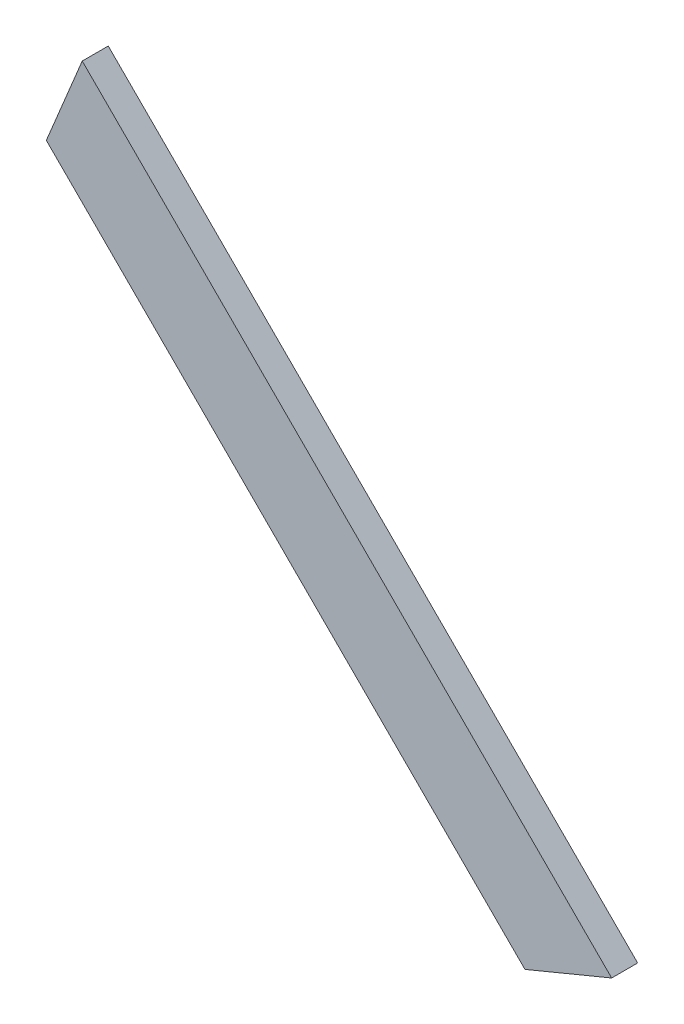
ISO-10303-21;
HEADER;
FILE_DESCRIPTION(('STEP AP214'),'2;1');
FILE_NAME('part.step','',(''),(''),'','','');
FILE_SCHEMA(('AUTOMOTIVE_DESIGN { 1 0 10303 214 1 1 1 1 }'));
ENDSEC;
DATA;
#1=APPLICATION_CONTEXT('core data for automotive mechanical design processes');
#2=APPLICATION_PROTOCOL_DEFINITION('international standard','automotive_design',2000,#1);
#3=PRODUCT_CONTEXT('',#1,'mechanical');
#4=PRODUCT('Part','Part','',(#3));
#5=PRODUCT_RELATED_PRODUCT_CATEGORY('part','',(#4));
#6=PRODUCT_DEFINITION_FORMATION('','',#4);
#7=PRODUCT_DEFINITION_CONTEXT('part definition',#1,'design');
#8=PRODUCT_DEFINITION('design','',#6,#7);
#9=PRODUCT_DEFINITION_SHAPE('','',#8);
#10=(LENGTH_UNIT() NAMED_UNIT(*) SI_UNIT(.MILLI.,.METRE.));
#11=(NAMED_UNIT(*) PLANE_ANGLE_UNIT() SI_UNIT($,.RADIAN.));
#12=(NAMED_UNIT(*) SI_UNIT($,.STERADIAN.) SOLID_ANGLE_UNIT());
#13=UNCERTAINTY_MEASURE_WITH_UNIT(LENGTH_MEASURE(1.E-05),#10,'distance_accuracy_value','');
#14=(GEOMETRIC_REPRESENTATION_CONTEXT(3) GLOBAL_UNCERTAINTY_ASSIGNED_CONTEXT((#13)) GLOBAL_UNIT_ASSIGNED_CONTEXT((#10,
#11,#12)) REPRESENTATION_CONTEXT('',''));
#15=CARTESIAN_POINT('',(0.,0.,0.));
#16=DIRECTION('',(0.,0.,1.));
#17=DIRECTION('',(1.,0.,0.));
#18=AXIS2_PLACEMENT_3D('',#15,#16,#17);
#19=CARTESIAN_POINT('',(-528.085778854874,1843.94678718592,19.05));
#20=DIRECTION('',(0.923879532511288,-0.382683432365086,0.));
#21=DIRECTION('',(0.382683432365086,0.923879532511288,0.));
#22=AXIS2_PLACEMENT_3D('',#19,#20,#21);
#23=PLANE('',#22);
#24=DIRECTION('',(-0.382683432365086,-0.923879532511288,0.));
#25=VECTOR('',#24,1.);
#26=CARTESIAN_POINT('',(-528.085778854874,1843.94678718592,0.));
#27=LINE('',#26,#25);
#28=CARTESIAN_POINT('',(-528.085778854874,1843.94678718592,0.));
#29=VERTEX_POINT('',#28);
#30=CARTESIAN_POINT('',(-554.388340065565,1780.44678718592,0.));
#31=VERTEX_POINT('',#30);
#32=EDGE_CURVE('E96',#29,#31,#27,.T.);
#33=ORIENTED_EDGE('',*,*,#32,.T.);
#34=DIRECTION('',(0.,0.,-1.));
#35=VECTOR('',#34,1.);
#36=CARTESIAN_POINT('',(-554.388340065565,1780.44678718592,19.05));
#37=LINE('',#36,#35);
#38=CARTESIAN_POINT('',(-554.388340065565,1780.44678718592,19.05));
#39=VERTEX_POINT('',#38);
#40=EDGE_CURVE('E11',#39,#31,#37,.T.);
#41=ORIENTED_EDGE('',*,*,#40,.F.);
#42=DIRECTION('',(-0.382683432365086,-0.923879532511288,0.));
#43=VECTOR('',#42,1.);
#44=CARTESIAN_POINT('',(-528.085778854874,1843.94678718592,19.05));
#45=LINE('',#44,#43);
#46=CARTESIAN_POINT('',(-528.085778854874,1843.94678718592,19.05));
#47=VERTEX_POINT('',#46);
#48=EDGE_CURVE('E84',#47,#39,#45,.T.);
#49=ORIENTED_EDGE('',*,*,#48,.F.);
#50=DIRECTION('',(0.,0.,-1.));
#51=VECTOR('',#50,1.);
#52=CARTESIAN_POINT('',(-528.085778854874,1843.94678718592,19.05));
#53=LINE('',#52,#51);
#54=EDGE_CURVE('E92',#47,#29,#53,.T.);
#55=ORIENTED_EDGE('',*,*,#54,.T.);
#56=EDGE_LOOP('',(#33,#41,#49,#55));
#57=FACE_BOUND('',#56,.T.);
#58=ADVANCED_FACE('F33',(#57),#23,.F.);
#59=CARTESIAN_POINT('',(-554.388340065565,1780.44678718592,19.05));
#60=DIRECTION('',(0.707106781186548,0.707106781186548,0.));
#61=DIRECTION('',(-0.707106781186548,0.707106781186548,0.));
#62=AXIS2_PLACEMENT_3D('',#59,#60,#61);
#63=PLANE('',#62);
#64=DIRECTION('',(0.707106781186548,-0.707106781186548,0.));
#65=VECTOR('',#64,1.);
#66=CARTESIAN_POINT('',(-554.388340065565,1780.44678718592,0.));
#67=LINE('',#66,#65);
#68=CARTESIAN_POINT('',(-203.784498249527,1429.84294536988,0.));
#69=VERTEX_POINT('',#68);
#70=EDGE_CURVE('E88',#31,#69,#67,.T.);
#71=ORIENTED_EDGE('',*,*,#70,.T.);
#72=DIRECTION('',(0.,0.,-1.));
#73=VECTOR('',#72,1.);
#74=CARTESIAN_POINT('',(-203.784498249527,1429.84294536988,19.05));
#75=LINE('',#74,#73);
#76=CARTESIAN_POINT('',(-203.784498249527,1429.84294536988,19.05));
#77=VERTEX_POINT('',#76);
#78=EDGE_CURVE('E41',#77,#69,#75,.T.);
#79=ORIENTED_EDGE('',*,*,#78,.F.);
#80=DIRECTION('',(0.707106781186548,-0.707106781186548,0.));
#81=VECTOR('',#80,1.);
#82=CARTESIAN_POINT('',(-554.388340065565,1780.44678718592,19.05));
#83=LINE('',#82,#81);
#84=EDGE_CURVE('E79',#39,#77,#83,.T.);
#85=ORIENTED_EDGE('',*,*,#84,.F.);
#86=ORIENTED_EDGE('',*,*,#40,.T.);
#87=EDGE_LOOP('',(#71,#79,#85,#86));
#88=FACE_BOUND('',#87,.T.);
#89=ADVANCED_FACE('F87',(#88),#63,.F.);
#90=CARTESIAN_POINT('',(-140.284498249528,1456.14550658058,19.05));
#91=DIRECTION('',(-0.38268343236509,0.923879532511287,0.));
#92=DIRECTION('',(-0.923879532511287,-0.38268343236509,0.));
#93=AXIS2_PLACEMENT_3D('',#90,#91,#92);
#94=PLANE('',#93);
#95=DIRECTION('',(0.923879532511287,0.38268343236509,0.));
#96=VECTOR('',#95,1.);
#97=CARTESIAN_POINT('',(-140.284498249528,1456.14550658058,0.));
#98=LINE('',#97,#96);
#99=CARTESIAN_POINT('',(-140.284498249528,1456.14550658058,0.));
#100=VERTEX_POINT('',#99);
#101=EDGE_CURVE('E66',#69,#100,#98,.T.);
#102=ORIENTED_EDGE('',*,*,#101,.T.);
#103=DIRECTION('',(0.,0.,-1.));
#104=VECTOR('',#103,1.);
#105=CARTESIAN_POINT('',(-140.284498249528,1456.14550658058,19.05));
#106=LINE('',#105,#104);
#107=CARTESIAN_POINT('',(-140.284498249528,1456.14550658058,19.05));
#108=VERTEX_POINT('',#107);
#109=EDGE_CURVE('E89',#108,#100,#106,.T.);
#110=ORIENTED_EDGE('',*,*,#109,.F.);
#111=DIRECTION('',(0.923879532511287,0.38268343236509,0.));
#112=VECTOR('',#111,1.);
#113=CARTESIAN_POINT('',(-140.284498249528,1456.14550658058,19.05));
#114=LINE('',#113,#112);
#115=EDGE_CURVE('E82',#77,#108,#114,.T.);
#116=ORIENTED_EDGE('',*,*,#115,.F.);
#117=ORIENTED_EDGE('',*,*,#78,.T.);
#118=EDGE_LOOP('',(#102,#110,#116,#117));
#119=FACE_BOUND('',#118,.T.);
#120=ADVANCED_FACE('F90',(#119),#94,.F.);
#121=CARTESIAN_POINT('',(-528.085778854874,1843.94678718592,19.05));
#122=DIRECTION('',(-0.707106781186547,-0.707106781186548,0.));
#123=DIRECTION('',(0.707106781186548,-0.707106781186547,0.));
#124=AXIS2_PLACEMENT_3D('',#121,#122,#123);
#125=PLANE('',#124);
#126=DIRECTION('',(-0.707106781186548,0.707106781186547,0.));
#127=VECTOR('',#126,1.);
#128=CARTESIAN_POINT('',(-528.085778854874,1843.94678718592,0.));
#129=LINE('',#128,#127);
#130=EDGE_CURVE('E72',#100,#29,#129,.T.);
#131=ORIENTED_EDGE('',*,*,#130,.T.);
#132=ORIENTED_EDGE('',*,*,#54,.F.);
#133=DIRECTION('',(-0.707106781186548,0.707106781186547,0.));
#134=VECTOR('',#133,1.);
#135=CARTESIAN_POINT('',(-528.085778854874,1843.94678718592,19.05));
#136=LINE('',#135,#134);
#137=EDGE_CURVE('E49',#108,#47,#136,.T.);
#138=ORIENTED_EDGE('',*,*,#137,.F.);
#139=ORIENTED_EDGE('',*,*,#109,.T.);
#140=EDGE_LOOP('',(#131,#132,#138,#139));
#141=FACE_BOUND('',#140,.T.);
#142=ADVANCED_FACE('F103',(#141),#125,.F.);
#143=CARTESIAN_POINT('',(0.,0.,19.05));
#144=DIRECTION('',(0.,0.,1.));
#145=DIRECTION('',(1.,0.,0.));
#146=AXIS2_PLACEMENT_3D('',#143,#144,#145);
#147=PLANE('',#146);
#148=ORIENTED_EDGE('',*,*,#48,.T.);
#149=ORIENTED_EDGE('',*,*,#84,.T.);
#150=ORIENTED_EDGE('',*,*,#115,.T.);
#151=ORIENTED_EDGE('',*,*,#137,.T.);
#152=EDGE_LOOP('',(#148,#149,#150,#151));
#153=FACE_BOUND('',#152,.T.);
#154=ADVANCED_FACE('F80',(#153),#147,.T.);
#155=CARTESIAN_POINT('',(0.,0.,0.));
#156=DIRECTION('',(0.,0.,1.));
#157=DIRECTION('',(1.,0.,0.));
#158=AXIS2_PLACEMENT_3D('',#155,#156,#157);
#159=PLANE('',#158);
#160=ORIENTED_EDGE('',*,*,#32,.F.);
#161=ORIENTED_EDGE('',*,*,#130,.F.);
#162=ORIENTED_EDGE('',*,*,#101,.F.);
#163=ORIENTED_EDGE('',*,*,#70,.F.);
#164=EDGE_LOOP('',(#160,#161,#162,#163));
#165=FACE_BOUND('',#164,.T.);
#166=ADVANCED_FACE('F106',(#165),#159,.F.);
#167=CLOSED_SHELL('',(#58,#89,#120,#142,#154,#166));
#168=MANIFOLD_SOLID_BREP('B2',#167);
#169=ADVANCED_BREP_SHAPE_REPRESENTATION('',(#18,#168),#14);
#170=SHAPE_DEFINITION_REPRESENTATION(#9,#169);
ENDSEC;
END-ISO-10303-21;
